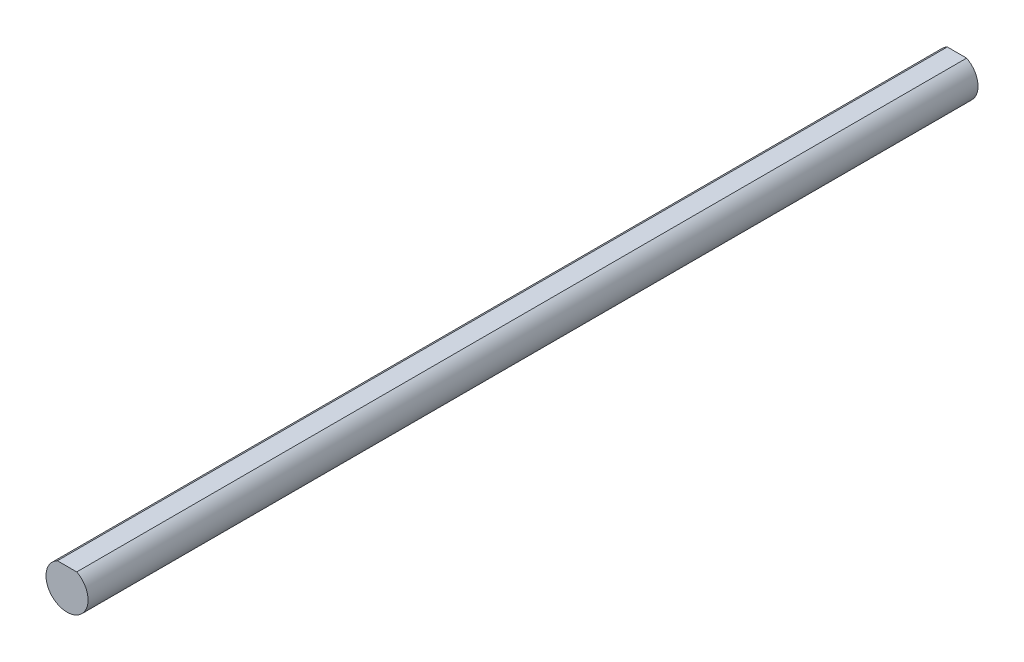
ISO-10303-21;
HEADER;
FILE_DESCRIPTION(('STEP AP214'),'2;1');
FILE_NAME('part.step','',(''),(''),'','','');
FILE_SCHEMA(('AUTOMOTIVE_DESIGN { 1 0 10303 214 1 1 1 1 }'));
ENDSEC;
DATA;
#1=APPLICATION_CONTEXT('core data for automotive mechanical design processes');
#2=APPLICATION_PROTOCOL_DEFINITION('international standard','automotive_design',2000,#1);
#3=PRODUCT_CONTEXT('',#1,'mechanical');
#4=PRODUCT('Part','Part','',(#3));
#5=PRODUCT_RELATED_PRODUCT_CATEGORY('part','',(#4));
#6=PRODUCT_DEFINITION_FORMATION('','',#4);
#7=PRODUCT_DEFINITION_CONTEXT('part definition',#1,'design');
#8=PRODUCT_DEFINITION('design','',#6,#7);
#9=PRODUCT_DEFINITION_SHAPE('','',#8);
#10=(LENGTH_UNIT() NAMED_UNIT(*) SI_UNIT(.MILLI.,.METRE.));
#11=(NAMED_UNIT(*) PLANE_ANGLE_UNIT() SI_UNIT($,.RADIAN.));
#12=(NAMED_UNIT(*) SI_UNIT($,.STERADIAN.) SOLID_ANGLE_UNIT());
#13=UNCERTAINTY_MEASURE_WITH_UNIT(LENGTH_MEASURE(1.E-05),#10,'distance_accuracy_value','');
#14=(GEOMETRIC_REPRESENTATION_CONTEXT(3) GLOBAL_UNCERTAINTY_ASSIGNED_CONTEXT((#13)) GLOBAL_UNIT_ASSIGNED_CONTEXT((#10,
#11,#12)) REPRESENTATION_CONTEXT('',''));
#15=CARTESIAN_POINT('',(0.,0.,0.));
#16=DIRECTION('',(0.,0.,1.));
#17=DIRECTION('',(1.,0.,0.));
#18=AXIS2_PLACEMENT_3D('',#15,#16,#17);
#19=CARTESIAN_POINT('',(0.,0.,-100.));
#20=DIRECTION('',(0.,0.,1.));
#21=DIRECTION('',(1.,0.,0.));
#22=AXIS2_PLACEMENT_3D('',#19,#20,#21);
#23=CYLINDRICAL_SURFACE('',#22,2.365);
#24=CARTESIAN_POINT('',(0.,0.,0.));
#25=DIRECTION('',(0.,0.,1.));
#26=DIRECTION('',(1.,0.,0.));
#27=AXIS2_PLACEMENT_3D('',#24,#25,#26);
#28=CIRCLE('',#27,2.365);
#29=CARTESIAN_POINT('',(-1.0877614628217,2.1,0.));
#30=VERTEX_POINT('',#29);
#31=CARTESIAN_POINT('',(1.0877614628217,2.1,0.));
#32=VERTEX_POINT('',#31);
#33=EDGE_CURVE('E62',#30,#32,#28,.T.);
#34=ORIENTED_EDGE('',*,*,#33,.F.);
#35=DIRECTION('',(0.,0.,1.));
#36=VECTOR('',#35,1.);
#37=CARTESIAN_POINT('',(-1.0877614628217,2.1,-100.));
#38=LINE('',#37,#36);
#39=CARTESIAN_POINT('',(-1.0877614628217,2.1,-100.));
#40=VERTEX_POINT('',#39);
#41=EDGE_CURVE('E11',#40,#30,#38,.T.);
#42=ORIENTED_EDGE('',*,*,#41,.F.);
#43=CARTESIAN_POINT('',(0.,0.,-100.));
#44=DIRECTION('',(0.,0.,1.));
#45=DIRECTION('',(1.,0.,0.));
#46=AXIS2_PLACEMENT_3D('',#43,#44,#45);
#47=CIRCLE('',#46,2.365);
#48=CARTESIAN_POINT('',(1.0877614628217,2.1,-100.));
#49=VERTEX_POINT('',#48);
#50=EDGE_CURVE('E66',#40,#49,#47,.T.);
#51=ORIENTED_EDGE('',*,*,#50,.T.);
#52=DIRECTION('',(0.,0.,1.));
#53=VECTOR('',#52,1.);
#54=CARTESIAN_POINT('',(1.0877614628217,2.1,-100.));
#55=LINE('',#54,#53);
#56=EDGE_CURVE('E36',#49,#32,#55,.T.);
#57=ORIENTED_EDGE('',*,*,#56,.T.);
#58=EDGE_LOOP('',(#34,#42,#51,#57));
#59=FACE_BOUND('',#58,.T.);
#60=ADVANCED_FACE('F33',(#59),#23,.T.);
#61=CARTESIAN_POINT('',(-1.0877614628217,2.1,-100.));
#62=DIRECTION('',(0.,1.,0.));
#63=DIRECTION('',(0.,0.,1.));
#64=AXIS2_PLACEMENT_3D('',#61,#62,#63);
#65=PLANE('',#64);
#66=DIRECTION('',(-1.,0.,0.));
#67=VECTOR('',#66,1.);
#68=CARTESIAN_POINT('',(-1.0877614628217,2.1,0.));
#69=LINE('',#68,#67);
#70=EDGE_CURVE('E59',#32,#30,#69,.T.);
#71=ORIENTED_EDGE('',*,*,#70,.F.);
#72=ORIENTED_EDGE('',*,*,#56,.F.);
#73=DIRECTION('',(-1.,0.,0.));
#74=VECTOR('',#73,1.);
#75=CARTESIAN_POINT('',(-1.0877614628217,2.1,-100.));
#76=LINE('',#75,#74);
#77=EDGE_CURVE('E61',#49,#40,#76,.T.);
#78=ORIENTED_EDGE('',*,*,#77,.T.);
#79=ORIENTED_EDGE('',*,*,#41,.T.);
#80=EDGE_LOOP('',(#71,#72,#78,#79));
#81=FACE_BOUND('',#80,.T.);
#82=ADVANCED_FACE('F57',(#81),#65,.T.);
#83=CARTESIAN_POINT('',(0.,0.,-100.));
#84=DIRECTION('',(0.,0.,1.));
#85=DIRECTION('',(1.,0.,0.));
#86=AXIS2_PLACEMENT_3D('',#83,#84,#85);
#87=PLANE('',#86);
#88=ORIENTED_EDGE('',*,*,#50,.F.);
#89=ORIENTED_EDGE('',*,*,#77,.F.);
#90=EDGE_LOOP('',(#88,#89));
#91=FACE_BOUND('',#90,.T.);
#92=ADVANCED_FACE('F71',(#91),#87,.F.);
#93=CARTESIAN_POINT('',(0.,0.,0.));
#94=DIRECTION('',(0.,0.,1.));
#95=DIRECTION('',(1.,0.,0.));
#96=AXIS2_PLACEMENT_3D('',#93,#94,#95);
#97=PLANE('',#96);
#98=ORIENTED_EDGE('',*,*,#33,.T.);
#99=ORIENTED_EDGE('',*,*,#70,.T.);
#100=EDGE_LOOP('',(#98,#99));
#101=FACE_BOUND('',#100,.T.);
#102=ADVANCED_FACE('F65',(#101),#97,.T.);
#103=CLOSED_SHELL('',(#60,#82,#92,#102));
#104=MANIFOLD_SOLID_BREP('B2',#103);
#105=ADVANCED_BREP_SHAPE_REPRESENTATION('',(#18,#104),#14);
#106=SHAPE_DEFINITION_REPRESENTATION(#9,#105);
ENDSEC;
END-ISO-10303-21;
